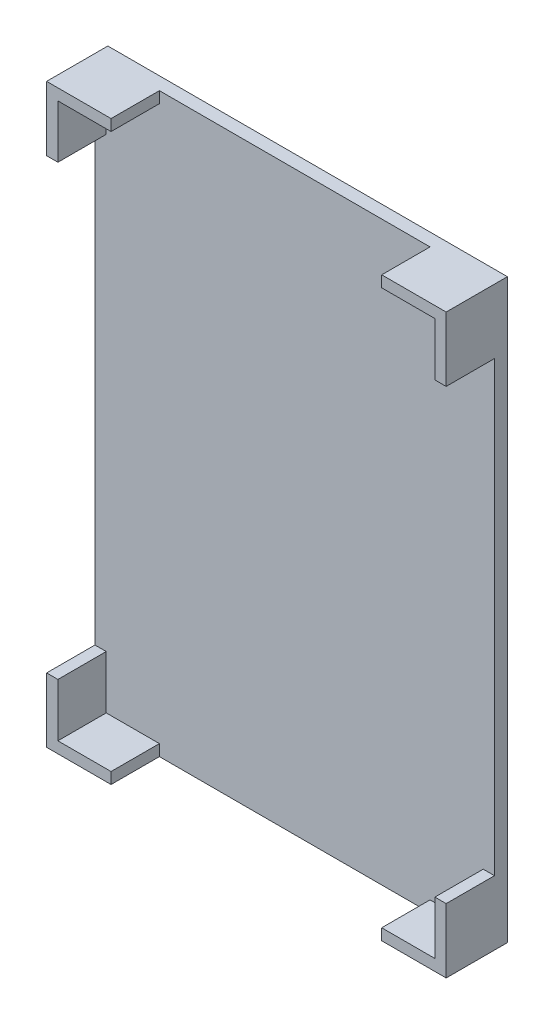
ISO-10303-21;
HEADER;
FILE_DESCRIPTION(('STEP AP214'),'2;1');
FILE_NAME('part.step','',(''),(''),'','','');
FILE_SCHEMA(('AUTOMOTIVE_DESIGN { 1 0 10303 214 1 1 1 1 }'));
ENDSEC;
DATA;
#1=APPLICATION_CONTEXT('core data for automotive mechanical design processes');
#2=APPLICATION_PROTOCOL_DEFINITION('international standard','automotive_design',2000,#1);
#3=PRODUCT_CONTEXT('',#1,'mechanical');
#4=PRODUCT('Part','Part','',(#3));
#5=PRODUCT_RELATED_PRODUCT_CATEGORY('part','',(#4));
#6=PRODUCT_DEFINITION_FORMATION('','',#4);
#7=PRODUCT_DEFINITION_CONTEXT('part definition',#1,'design');
#8=PRODUCT_DEFINITION('design','',#6,#7);
#9=PRODUCT_DEFINITION_SHAPE('','',#8);
#10=(LENGTH_UNIT() NAMED_UNIT(*) SI_UNIT(.MILLI.,.METRE.));
#11=(NAMED_UNIT(*) PLANE_ANGLE_UNIT() SI_UNIT($,.RADIAN.));
#12=(NAMED_UNIT(*) SI_UNIT($,.STERADIAN.) SOLID_ANGLE_UNIT());
#13=UNCERTAINTY_MEASURE_WITH_UNIT(LENGTH_MEASURE(1.E-05),#10,'distance_accuracy_value','');
#14=(GEOMETRIC_REPRESENTATION_CONTEXT(3) GLOBAL_UNCERTAINTY_ASSIGNED_CONTEXT((#13)) GLOBAL_UNIT_ASSIGNED_CONTEXT((#10,
#11,#12)) REPRESENTATION_CONTEXT('',''));
#15=CARTESIAN_POINT('',(0.,0.,0.));
#16=DIRECTION('',(0.,0.,1.));
#17=DIRECTION('',(1.,0.,0.));
#18=AXIS2_PLACEMENT_3D('',#15,#16,#17);
#19=CARTESIAN_POINT('',(0.,0.,4.));
#20=DIRECTION('',(0.,0.,1.));
#21=DIRECTION('',(1.,0.,0.));
#22=AXIS2_PLACEMENT_3D('',#19,#20,#21);
#23=PLANE('',#22);
#24=DIRECTION('',(0.,-1.,0.));
#25=VECTOR('',#24,1.);
#26=CARTESIAN_POINT('',(-62.,89.5,4.));
#27=LINE('',#26,#25);
#28=CARTESIAN_POINT('',(-62.,69.5,4.));
#29=VERTEX_POINT('',#28);
#30=CARTESIAN_POINT('',(-62.,-69.4999999999999,4.));
#31=VERTEX_POINT('',#30);
#32=EDGE_CURVE('E351',#29,#31,#27,.T.);
#33=ORIENTED_EDGE('',*,*,#32,.T.);
#34=DIRECTION('',(-1.,0.,0.));
#35=VECTOR('',#34,1.);
#36=CARTESIAN_POINT('',(-62.,-69.5,4.));
#37=LINE('',#36,#35);
#38=CARTESIAN_POINT('',(-58.5,-69.5,4.));
#39=VERTEX_POINT('',#38);
#40=EDGE_CURVE('E56',#39,#31,#37,.T.);
#41=ORIENTED_EDGE('',*,*,#40,.F.);
#42=DIRECTION('',(0.,1.,0.));
#43=VECTOR('',#42,1.);
#44=CARTESIAN_POINT('',(-58.5,-69.5,4.));
#45=LINE('',#44,#43);
#46=CARTESIAN_POINT('',(-58.5,-86.,4.));
#47=VERTEX_POINT('',#46);
#48=EDGE_CURVE('E60',#47,#39,#45,.T.);
#49=ORIENTED_EDGE('',*,*,#48,.F.);
#50=DIRECTION('',(-1.,0.,0.));
#51=VECTOR('',#50,1.);
#52=CARTESIAN_POINT('',(-58.5,-86.,4.));
#53=LINE('',#52,#51);
#54=CARTESIAN_POINT('',(-42.,-86.,4.));
#55=VERTEX_POINT('',#54);
#56=EDGE_CURVE('E222',#55,#47,#53,.T.);
#57=ORIENTED_EDGE('',*,*,#56,.F.);
#58=DIRECTION('',(0.,1.,0.));
#59=VECTOR('',#58,1.);
#60=CARTESIAN_POINT('',(-42.,-86.,4.));
#61=LINE('',#60,#59);
#62=CARTESIAN_POINT('',(-42.,-89.5,4.));
#63=VERTEX_POINT('',#62);
#64=EDGE_CURVE('E219',#63,#55,#61,.T.);
#65=ORIENTED_EDGE('',*,*,#64,.F.);
#66=DIRECTION('',(1.,0.,0.));
#67=VECTOR('',#66,1.);
#68=CARTESIAN_POINT('',(-62.,-89.5,4.));
#69=LINE('',#68,#67);
#70=CARTESIAN_POINT('',(42.,-89.5,4.));
#71=VERTEX_POINT('',#70);
#72=EDGE_CURVE('E353',#63,#71,#69,.T.);
#73=ORIENTED_EDGE('',*,*,#72,.T.);
#74=DIRECTION('',(0.,-1.,0.));
#75=VECTOR('',#74,1.);
#76=CARTESIAN_POINT('',(42.,-86.,4.));
#77=LINE('',#76,#75);
#78=CARTESIAN_POINT('',(42.,-86.,4.));
#79=VERTEX_POINT('',#78);
#80=EDGE_CURVE('E236',#79,#71,#77,.T.);
#81=ORIENTED_EDGE('',*,*,#80,.F.);
#82=DIRECTION('',(-1.,0.,0.));
#83=VECTOR('',#82,1.);
#84=CARTESIAN_POINT('',(58.5,-86.,4.));
#85=LINE('',#84,#83);
#86=CARTESIAN_POINT('',(58.5,-86.,4.));
#87=VERTEX_POINT('',#86);
#88=EDGE_CURVE('E249',#87,#79,#85,.T.);
#89=ORIENTED_EDGE('',*,*,#88,.F.);
#90=DIRECTION('',(0.,-1.,0.));
#91=VECTOR('',#90,1.);
#92=CARTESIAN_POINT('',(58.5,-69.5,4.));
#93=LINE('',#92,#91);
#94=CARTESIAN_POINT('',(58.5,-69.5,4.));
#95=VERTEX_POINT('',#94);
#96=EDGE_CURVE('E226',#95,#87,#93,.T.);
#97=ORIENTED_EDGE('',*,*,#96,.F.);
#98=DIRECTION('',(-1.,0.,0.));
#99=VECTOR('',#98,1.);
#100=CARTESIAN_POINT('',(62.,-69.5,4.));
#101=LINE('',#100,#99);
#102=CARTESIAN_POINT('',(62.,-69.4999999999999,4.));
#103=VERTEX_POINT('',#102);
#104=EDGE_CURVE('E223',#103,#95,#101,.T.);
#105=ORIENTED_EDGE('',*,*,#104,.F.);
#106=DIRECTION('',(0.,1.,0.));
#107=VECTOR('',#106,1.);
#108=CARTESIAN_POINT('',(62.,89.5,4.));
#109=LINE('',#108,#107);
#110=CARTESIAN_POINT('',(62.,69.5,4.));
#111=VERTEX_POINT('',#110);
#112=EDGE_CURVE('E346',#103,#111,#109,.T.);
#113=ORIENTED_EDGE('',*,*,#112,.T.);
#114=DIRECTION('',(1.,0.,0.));
#115=VECTOR('',#114,1.);
#116=CARTESIAN_POINT('',(62.,69.5,4.));
#117=LINE('',#116,#115);
#118=CARTESIAN_POINT('',(58.5,69.5,4.));
#119=VERTEX_POINT('',#118);
#120=EDGE_CURVE('E289',#119,#111,#117,.T.);
#121=ORIENTED_EDGE('',*,*,#120,.F.);
#122=DIRECTION('',(0.,-1.,0.));
#123=VECTOR('',#122,1.);
#124=CARTESIAN_POINT('',(58.5,69.5,4.));
#125=LINE('',#124,#123);
#126=CARTESIAN_POINT('',(58.5,86.,4.));
#127=VERTEX_POINT('',#126);
#128=EDGE_CURVE('E287',#127,#119,#125,.T.);
#129=ORIENTED_EDGE('',*,*,#128,.F.);
#130=DIRECTION('',(1.,0.,0.));
#131=VECTOR('',#130,1.);
#132=CARTESIAN_POINT('',(58.5,86.,4.));
#133=LINE('',#132,#131);
#134=CARTESIAN_POINT('',(42.,86.,4.));
#135=VERTEX_POINT('',#134);
#136=EDGE_CURVE('E268',#135,#127,#133,.T.);
#137=ORIENTED_EDGE('',*,*,#136,.F.);
#138=DIRECTION('',(0.,-1.,0.));
#139=VECTOR('',#138,1.);
#140=CARTESIAN_POINT('',(42.,86.,4.));
#141=LINE('',#140,#139);
#142=CARTESIAN_POINT('',(42.,89.5,4.));
#143=VERTEX_POINT('',#142);
#144=EDGE_CURVE('E273',#143,#135,#141,.T.);
#145=ORIENTED_EDGE('',*,*,#144,.F.);
#146=DIRECTION('',(-1.,0.,0.));
#147=VECTOR('',#146,1.);
#148=CARTESIAN_POINT('',(-62.,89.5,4.));
#149=LINE('',#148,#147);
#150=CARTESIAN_POINT('',(-42.,89.5,4.));
#151=VERTEX_POINT('',#150);
#152=EDGE_CURVE('E348',#143,#151,#149,.T.);
#153=ORIENTED_EDGE('',*,*,#152,.T.);
#154=DIRECTION('',(0.,1.,0.));
#155=VECTOR('',#154,1.);
#156=CARTESIAN_POINT('',(-42.,86.,4.));
#157=LINE('',#156,#155);
#158=CARTESIAN_POINT('',(-42.,86.,4.));
#159=VERTEX_POINT('',#158);
#160=EDGE_CURVE('E310',#159,#151,#157,.T.);
#161=ORIENTED_EDGE('',*,*,#160,.F.);
#162=DIRECTION('',(1.,0.,0.));
#163=VECTOR('',#162,1.);
#164=CARTESIAN_POINT('',(-58.5,86.,4.));
#165=LINE('',#164,#163);
#166=CARTESIAN_POINT('',(-58.5,86.,4.));
#167=VERTEX_POINT('',#166);
#168=EDGE_CURVE('E326',#167,#159,#165,.T.);
#169=ORIENTED_EDGE('',*,*,#168,.F.);
#170=DIRECTION('',(0.,1.,0.));
#171=VECTOR('',#170,1.);
#172=CARTESIAN_POINT('',(-58.5,69.5,4.));
#173=LINE('',#172,#171);
#174=CARTESIAN_POINT('',(-58.5,69.5,4.));
#175=VERTEX_POINT('',#174);
#176=EDGE_CURVE('E323',#175,#167,#173,.T.);
#177=ORIENTED_EDGE('',*,*,#176,.F.);
#178=DIRECTION('',(1.,0.,0.));
#179=VECTOR('',#178,1.);
#180=CARTESIAN_POINT('',(-62.,69.5,4.));
#181=LINE('',#180,#179);
#182=EDGE_CURVE('E305',#29,#175,#181,.T.);
#183=ORIENTED_EDGE('',*,*,#182,.F.);
#184=EDGE_LOOP('',(#33,#41,#49,#57,#65,#73,#81,#89,#97,#105,#113,#121,#129,#137,#145,#153,#161,
#169,#177,#183));
#185=FACE_BOUND('',#184,.T.);
#186=ADVANCED_FACE('F41',(#185),#23,.T.);
#187=CARTESIAN_POINT('',(62.,89.5,4.));
#188=DIRECTION('',(-1.,0.,0.));
#189=DIRECTION('',(0.,-1.,0.));
#190=AXIS2_PLACEMENT_3D('',#187,#188,#189);
#191=PLANE('',#190);
#192=DIRECTION('',(0.,1.,0.));
#193=VECTOR('',#192,1.);
#194=CARTESIAN_POINT('',(62.,89.5,0.));
#195=LINE('',#194,#193);
#196=CARTESIAN_POINT('',(62.,-89.5,0.));
#197=VERTEX_POINT('',#196);
#198=CARTESIAN_POINT('',(62.,89.5,0.));
#199=VERTEX_POINT('',#198);
#200=EDGE_CURVE('E345',#197,#199,#195,.T.);
#201=ORIENTED_EDGE('',*,*,#200,.T.);
#202=DIRECTION('',(0.,0.,-1.));
#203=VECTOR('',#202,1.);
#204=CARTESIAN_POINT('',(62.,89.5,4.));
#205=LINE('',#204,#203);
#206=CARTESIAN_POINT('',(62.,89.5,19.));
#207=VERTEX_POINT('',#206);
#208=EDGE_CURVE('E11',#207,#199,#205,.T.);
#209=ORIENTED_EDGE('',*,*,#208,.F.);
#210=DIRECTION('',(0.,1.,0.));
#211=VECTOR('',#210,1.);
#212=CARTESIAN_POINT('',(62.,89.5,19.));
#213=LINE('',#212,#211);
#214=CARTESIAN_POINT('',(62.,69.5,19.));
#215=VERTEX_POINT('',#214);
#216=EDGE_CURVE('E277',#215,#207,#213,.T.);
#217=ORIENTED_EDGE('',*,*,#216,.F.);
#218=DIRECTION('',(0.,0.,-1.));
#219=VECTOR('',#218,1.);
#220=CARTESIAN_POINT('',(62.,69.5,19.));
#221=LINE('',#220,#219);
#222=EDGE_CURVE('E297',#215,#111,#221,.T.);
#223=ORIENTED_EDGE('',*,*,#222,.T.);
#224=ORIENTED_EDGE('',*,*,#112,.F.);
#225=DIRECTION('',(0.,0.,-1.));
#226=VECTOR('',#225,1.);
#227=CARTESIAN_POINT('',(62.,-69.5,19.));
#228=LINE('',#227,#226);
#229=CARTESIAN_POINT('',(62.,-69.5,19.));
#230=VERTEX_POINT('',#229);
#231=EDGE_CURVE('E265',#230,#103,#228,.T.);
#232=ORIENTED_EDGE('',*,*,#231,.F.);
#233=DIRECTION('',(0.,1.,0.));
#234=VECTOR('',#233,1.);
#235=CARTESIAN_POINT('',(62.,-89.5,19.));
#236=LINE('',#235,#234);
#237=CARTESIAN_POINT('',(62.,-89.5,19.));
#238=VERTEX_POINT('',#237);
#239=EDGE_CURVE('E235',#238,#230,#236,.T.);
#240=ORIENTED_EDGE('',*,*,#239,.F.);
#241=DIRECTION('',(0.,0.,-1.));
#242=VECTOR('',#241,1.);
#243=CARTESIAN_POINT('',(62.,-89.5,4.));
#244=LINE('',#243,#242);
#245=EDGE_CURVE('E355',#238,#197,#244,.T.);
#246=ORIENTED_EDGE('',*,*,#245,.T.);
#247=EDGE_LOOP('',(#201,#209,#217,#223,#224,#232,#240,#246));
#248=FACE_BOUND('',#247,.T.);
#249=ADVANCED_FACE('F43',(#248),#191,.F.);
#250=CARTESIAN_POINT('',(-62.,89.5,4.));
#251=DIRECTION('',(0.,-1.,0.));
#252=DIRECTION('',(1.,0.,0.));
#253=AXIS2_PLACEMENT_3D('',#250,#251,#252);
#254=PLANE('',#253);
#255=DIRECTION('',(-1.,0.,0.));
#256=VECTOR('',#255,1.);
#257=CARTESIAN_POINT('',(-62.,89.5,0.));
#258=LINE('',#257,#256);
#259=CARTESIAN_POINT('',(-62.,89.5,0.));
#260=VERTEX_POINT('',#259);
#261=EDGE_CURVE('E358',#199,#260,#258,.T.);
#262=ORIENTED_EDGE('',*,*,#261,.T.);
#263=DIRECTION('',(0.,0.,-1.));
#264=VECTOR('',#263,1.);
#265=CARTESIAN_POINT('',(-62.,89.5,4.));
#266=LINE('',#265,#264);
#267=CARTESIAN_POINT('',(-62.,89.5,19.));
#268=VERTEX_POINT('',#267);
#269=EDGE_CURVE('E49',#268,#260,#266,.T.);
#270=ORIENTED_EDGE('',*,*,#269,.F.);
#271=DIRECTION('',(-1.,0.,0.));
#272=VECTOR('',#271,1.);
#273=CARTESIAN_POINT('',(-42.,89.5,19.));
#274=LINE('',#273,#272);
#275=CARTESIAN_POINT('',(-42.,89.5,19.));
#276=VERTEX_POINT('',#275);
#277=EDGE_CURVE('E306',#276,#268,#274,.T.);
#278=ORIENTED_EDGE('',*,*,#277,.F.);
#279=DIRECTION('',(0.,0.,-1.));
#280=VECTOR('',#279,1.);
#281=CARTESIAN_POINT('',(-42.,89.5,19.));
#282=LINE('',#281,#280);
#283=EDGE_CURVE('E320',#276,#151,#282,.T.);
#284=ORIENTED_EDGE('',*,*,#283,.T.);
#285=ORIENTED_EDGE('',*,*,#152,.F.);
#286=DIRECTION('',(0.,0.,-1.));
#287=VECTOR('',#286,1.);
#288=CARTESIAN_POINT('',(42.,89.5,19.));
#289=LINE('',#288,#287);
#290=CARTESIAN_POINT('',(42.,89.5,19.));
#291=VERTEX_POINT('',#290);
#292=EDGE_CURVE('E295',#291,#143,#289,.T.);
#293=ORIENTED_EDGE('',*,*,#292,.F.);
#294=DIRECTION('',(-1.,0.,0.));
#295=VECTOR('',#294,1.);
#296=CARTESIAN_POINT('',(42.,89.5,19.));
#297=LINE('',#296,#295);
#298=EDGE_CURVE('E280',#207,#291,#297,.T.);
#299=ORIENTED_EDGE('',*,*,#298,.F.);
#300=ORIENTED_EDGE('',*,*,#208,.T.);
#301=EDGE_LOOP('',(#262,#270,#278,#284,#285,#293,#299,#300));
#302=FACE_BOUND('',#301,.T.);
#303=ADVANCED_FACE('F423',(#302),#254,.F.);
#304=CARTESIAN_POINT('',(-62.,89.5,4.));
#305=DIRECTION('',(1.,0.,0.));
#306=DIRECTION('',(0.,1.,0.));
#307=AXIS2_PLACEMENT_3D('',#304,#305,#306);
#308=PLANE('',#307);
#309=DIRECTION('',(0.,-1.,0.));
#310=VECTOR('',#309,1.);
#311=CARTESIAN_POINT('',(-62.,89.5,0.));
#312=LINE('',#311,#310);
#313=CARTESIAN_POINT('',(-62.,-89.5,0.));
#314=VERTEX_POINT('',#313);
#315=EDGE_CURVE('E360',#260,#314,#312,.T.);
#316=ORIENTED_EDGE('',*,*,#315,.T.);
#317=DIRECTION('',(0.,0.,-1.));
#318=VECTOR('',#317,1.);
#319=CARTESIAN_POINT('',(-62.,-89.5,4.));
#320=LINE('',#319,#318);
#321=CARTESIAN_POINT('',(-62.,-89.5,19.));
#322=VERTEX_POINT('',#321);
#323=EDGE_CURVE('E365',#322,#314,#320,.T.);
#324=ORIENTED_EDGE('',*,*,#323,.F.);
#325=DIRECTION('',(0.,-1.,0.));
#326=VECTOR('',#325,1.);
#327=CARTESIAN_POINT('',(-62.,-89.5,19.));
#328=LINE('',#327,#326);
#329=CARTESIAN_POINT('',(-62.,-69.5,19.));
#330=VERTEX_POINT('',#329);
#331=EDGE_CURVE('E493',#330,#322,#328,.T.);
#332=ORIENTED_EDGE('',*,*,#331,.F.);
#333=DIRECTION('',(0.,0.,-1.));
#334=VECTOR('',#333,1.);
#335=CARTESIAN_POINT('',(-62.,-69.5,19.));
#336=LINE('',#335,#334);
#337=EDGE_CURVE('E228',#330,#31,#336,.T.);
#338=ORIENTED_EDGE('',*,*,#337,.T.);
#339=ORIENTED_EDGE('',*,*,#32,.F.);
#340=DIRECTION('',(0.,0.,-1.));
#341=VECTOR('',#340,1.);
#342=CARTESIAN_POINT('',(-62.,69.5,19.));
#343=LINE('',#342,#341);
#344=CARTESIAN_POINT('',(-62.,69.5,19.));
#345=VERTEX_POINT('',#344);
#346=EDGE_CURVE('E342',#345,#29,#343,.T.);
#347=ORIENTED_EDGE('',*,*,#346,.F.);
#348=DIRECTION('',(0.,-1.,0.));
#349=VECTOR('',#348,1.);
#350=CARTESIAN_POINT('',(-62.,89.5,19.));
#351=LINE('',#350,#349);
#352=EDGE_CURVE('E309',#268,#345,#351,.T.);
#353=ORIENTED_EDGE('',*,*,#352,.F.);
#354=ORIENTED_EDGE('',*,*,#269,.T.);
#355=EDGE_LOOP('',(#316,#324,#332,#338,#339,#347,#353,#354));
#356=FACE_BOUND('',#355,.T.);
#357=ADVANCED_FACE('F371',(#356),#308,.F.);
#358=CARTESIAN_POINT('',(-62.,-89.5,4.));
#359=DIRECTION('',(0.,1.,0.));
#360=DIRECTION('',(0.,0.,1.));
#361=AXIS2_PLACEMENT_3D('',#358,#359,#360);
#362=PLANE('',#361);
#363=DIRECTION('',(1.,0.,0.));
#364=VECTOR('',#363,1.);
#365=CARTESIAN_POINT('',(-62.,-89.5,0.));
#366=LINE('',#365,#364);
#367=EDGE_CURVE('E349',#314,#197,#366,.T.);
#368=ORIENTED_EDGE('',*,*,#367,.T.);
#369=ORIENTED_EDGE('',*,*,#245,.F.);
#370=DIRECTION('',(1.,0.,0.));
#371=VECTOR('',#370,1.);
#372=CARTESIAN_POINT('',(42.,-89.5,19.));
#373=LINE('',#372,#371);
#374=CARTESIAN_POINT('',(42.,-89.5,19.));
#375=VERTEX_POINT('',#374);
#376=EDGE_CURVE('E232',#375,#238,#373,.T.);
#377=ORIENTED_EDGE('',*,*,#376,.F.);
#378=DIRECTION('',(0.,0.,-1.));
#379=VECTOR('',#378,1.);
#380=CARTESIAN_POINT('',(42.,-89.5,19.));
#381=LINE('',#380,#379);
#382=EDGE_CURVE('E245',#375,#71,#381,.T.);
#383=ORIENTED_EDGE('',*,*,#382,.T.);
#384=ORIENTED_EDGE('',*,*,#72,.F.);
#385=DIRECTION('',(0.,0.,-1.));
#386=VECTOR('',#385,1.);
#387=CARTESIAN_POINT('',(-42.,-89.5,19.));
#388=LINE('',#387,#386);
#389=CARTESIAN_POINT('',(-42.,-89.5,19.));
#390=VERTEX_POINT('',#389);
#391=EDGE_CURVE('E487',#390,#63,#388,.T.);
#392=ORIENTED_EDGE('',*,*,#391,.F.);
#393=DIRECTION('',(1.,0.,0.));
#394=VECTOR('',#393,1.);
#395=CARTESIAN_POINT('',(-42.,-89.5,19.));
#396=LINE('',#395,#394);
#397=EDGE_CURVE('E491',#322,#390,#396,.T.);
#398=ORIENTED_EDGE('',*,*,#397,.F.);
#399=ORIENTED_EDGE('',*,*,#323,.T.);
#400=EDGE_LOOP('',(#368,#369,#377,#383,#384,#392,#398,#399));
#401=FACE_BOUND('',#400,.T.);
#402=ADVANCED_FACE('F380',(#401),#362,.F.);
#403=CARTESIAN_POINT('',(0.,0.,0.));
#404=DIRECTION('',(0.,0.,1.));
#405=DIRECTION('',(1.,0.,0.));
#406=AXIS2_PLACEMENT_3D('',#403,#404,#405);
#407=PLANE('',#406);
#408=ORIENTED_EDGE('',*,*,#200,.F.);
#409=ORIENTED_EDGE('',*,*,#367,.F.);
#410=ORIENTED_EDGE('',*,*,#315,.F.);
#411=ORIENTED_EDGE('',*,*,#261,.F.);
#412=EDGE_LOOP('',(#408,#409,#410,#411));
#413=FACE_BOUND('',#412,.T.);
#414=ADVANCED_FACE('F378',(#413),#407,.F.);
#415=CARTESIAN_POINT('',(-62.,69.5,19.));
#416=DIRECTION('',(0.,1.,0.));
#417=DIRECTION('',(0.,0.,1.));
#418=AXIS2_PLACEMENT_3D('',#415,#416,#417);
#419=PLANE('',#418);
#420=ORIENTED_EDGE('',*,*,#182,.T.);
#421=DIRECTION('',(0.,0.,-1.));
#422=VECTOR('',#421,1.);
#423=CARTESIAN_POINT('',(-58.5,69.5,19.));
#424=LINE('',#423,#422);
#425=CARTESIAN_POINT('',(-58.5,69.5,19.));
#426=VERTEX_POINT('',#425);
#427=EDGE_CURVE('E339',#426,#175,#424,.T.);
#428=ORIENTED_EDGE('',*,*,#427,.F.);
#429=DIRECTION('',(1.,0.,0.));
#430=VECTOR('',#429,1.);
#431=CARTESIAN_POINT('',(-62.,69.5,19.));
#432=LINE('',#431,#430);
#433=EDGE_CURVE('E312',#345,#426,#432,.T.);
#434=ORIENTED_EDGE('',*,*,#433,.F.);
#435=ORIENTED_EDGE('',*,*,#346,.T.);
#436=EDGE_LOOP('',(#420,#428,#434,#435));
#437=FACE_BOUND('',#436,.T.);
#438=ADVANCED_FACE('F426',(#437),#419,.F.);
#439=CARTESIAN_POINT('',(-58.5,69.5,19.));
#440=DIRECTION('',(-1.,0.,0.));
#441=DIRECTION('',(0.,0.,1.));
#442=AXIS2_PLACEMENT_3D('',#439,#440,#441);
#443=PLANE('',#442);
#444=ORIENTED_EDGE('',*,*,#176,.T.);
#445=DIRECTION('',(0.,0.,-1.));
#446=VECTOR('',#445,1.);
#447=CARTESIAN_POINT('',(-58.5,86.,19.));
#448=LINE('',#447,#446);
#449=CARTESIAN_POINT('',(-58.5,86.,19.));
#450=VERTEX_POINT('',#449);
#451=EDGE_CURVE('E336',#450,#167,#448,.T.);
#452=ORIENTED_EDGE('',*,*,#451,.F.);
#453=DIRECTION('',(0.,1.,0.));
#454=VECTOR('',#453,1.);
#455=CARTESIAN_POINT('',(-58.5,69.5,19.));
#456=LINE('',#455,#454);
#457=EDGE_CURVE('E314',#426,#450,#456,.T.);
#458=ORIENTED_EDGE('',*,*,#457,.F.);
#459=ORIENTED_EDGE('',*,*,#427,.T.);
#460=EDGE_LOOP('',(#444,#452,#458,#459));
#461=FACE_BOUND('',#460,.T.);
#462=ADVANCED_FACE('F469',(#461),#443,.F.);
#463=CARTESIAN_POINT('',(-58.5,86.,19.));
#464=DIRECTION('',(0.,1.,0.));
#465=DIRECTION('',(0.,0.,1.));
#466=AXIS2_PLACEMENT_3D('',#463,#464,#465);
#467=PLANE('',#466);
#468=ORIENTED_EDGE('',*,*,#168,.T.);
#469=DIRECTION('',(0.,0.,-1.));
#470=VECTOR('',#469,1.);
#471=CARTESIAN_POINT('',(-42.,86.,19.));
#472=LINE('',#471,#470);
#473=CARTESIAN_POINT('',(-42.,86.,19.));
#474=VERTEX_POINT('',#473);
#475=EDGE_CURVE('E333',#474,#159,#472,.T.);
#476=ORIENTED_EDGE('',*,*,#475,.F.);
#477=DIRECTION('',(1.,0.,0.));
#478=VECTOR('',#477,1.);
#479=CARTESIAN_POINT('',(-58.5,86.,19.));
#480=LINE('',#479,#478);
#481=EDGE_CURVE('E316',#450,#474,#480,.T.);
#482=ORIENTED_EDGE('',*,*,#481,.F.);
#483=ORIENTED_EDGE('',*,*,#451,.T.);
#484=EDGE_LOOP('',(#468,#476,#482,#483));
#485=FACE_BOUND('',#484,.T.);
#486=ADVANCED_FACE('F464',(#485),#467,.F.);
#487=CARTESIAN_POINT('',(-42.,86.,19.));
#488=DIRECTION('',(-1.,0.,0.));
#489=DIRECTION('',(0.,0.,1.));
#490=AXIS2_PLACEMENT_3D('',#487,#488,#489);
#491=PLANE('',#490);
#492=ORIENTED_EDGE('',*,*,#160,.T.);
#493=ORIENTED_EDGE('',*,*,#283,.F.);
#494=DIRECTION('',(0.,1.,0.));
#495=VECTOR('',#494,1.);
#496=CARTESIAN_POINT('',(-42.,86.,19.));
#497=LINE('',#496,#495);
#498=EDGE_CURVE('E318',#474,#276,#497,.T.);
#499=ORIENTED_EDGE('',*,*,#498,.F.);
#500=ORIENTED_EDGE('',*,*,#475,.T.);
#501=EDGE_LOOP('',(#492,#493,#499,#500));
#502=FACE_BOUND('',#501,.T.);
#503=ADVANCED_FACE('F461',(#502),#491,.F.);
#504=CARTESIAN_POINT('',(0.,0.,19.));
#505=DIRECTION('',(0.,0.,1.));
#506=DIRECTION('',(1.,0.,0.));
#507=AXIS2_PLACEMENT_3D('',#504,#505,#506);
#508=PLANE('',#507);
#509=ORIENTED_EDGE('',*,*,#277,.T.);
#510=ORIENTED_EDGE('',*,*,#352,.T.);
#511=ORIENTED_EDGE('',*,*,#433,.T.);
#512=ORIENTED_EDGE('',*,*,#457,.T.);
#513=ORIENTED_EDGE('',*,*,#481,.T.);
#514=ORIENTED_EDGE('',*,*,#498,.T.);
#515=EDGE_LOOP('',(#509,#510,#511,#512,#513,#514));
#516=FACE_BOUND('',#515,.T.);
#517=ADVANCED_FACE('F604',(#516),#508,.T.);
#518=CARTESIAN_POINT('',(58.5,86.,19.));
#519=DIRECTION('',(0.,1.,0.));
#520=DIRECTION('',(0.,0.,1.));
#521=AXIS2_PLACEMENT_3D('',#518,#519,#520);
#522=PLANE('',#521);
#523=ORIENTED_EDGE('',*,*,#136,.T.);
#524=DIRECTION('',(0.,0.,-1.));
#525=VECTOR('',#524,1.);
#526=CARTESIAN_POINT('',(58.5,86.,19.));
#527=LINE('',#526,#525);
#528=CARTESIAN_POINT('',(58.5,86.,19.));
#529=VERTEX_POINT('',#528);
#530=EDGE_CURVE('E303',#529,#127,#527,.T.);
#531=ORIENTED_EDGE('',*,*,#530,.F.);
#532=DIRECTION('',(1.,0.,0.));
#533=VECTOR('',#532,1.);
#534=CARTESIAN_POINT('',(58.5,86.,19.));
#535=LINE('',#534,#533);
#536=CARTESIAN_POINT('',(42.,86.,19.));
#537=VERTEX_POINT('',#536);
#538=EDGE_CURVE('E269',#537,#529,#535,.T.);
#539=ORIENTED_EDGE('',*,*,#538,.F.);
#540=DIRECTION('',(0.,0.,-1.));
#541=VECTOR('',#540,1.);
#542=CARTESIAN_POINT('',(42.,86.,19.));
#543=LINE('',#542,#541);
#544=EDGE_CURVE('E284',#537,#135,#543,.T.);
#545=ORIENTED_EDGE('',*,*,#544,.T.);
#546=EDGE_LOOP('',(#523,#531,#539,#545));
#547=FACE_BOUND('',#546,.T.);
#548=ADVANCED_FACE('F453',(#547),#522,.F.);
#549=CARTESIAN_POINT('',(58.5,69.5,19.));
#550=DIRECTION('',(1.,0.,0.));
#551=DIRECTION('',(0.,0.,-1.));
#552=AXIS2_PLACEMENT_3D('',#549,#550,#551);
#553=PLANE('',#552);
#554=ORIENTED_EDGE('',*,*,#128,.T.);
#555=DIRECTION('',(0.,0.,-1.));
#556=VECTOR('',#555,1.);
#557=CARTESIAN_POINT('',(58.5,69.5,19.));
#558=LINE('',#557,#556);
#559=CARTESIAN_POINT('',(58.5,69.5,19.));
#560=VERTEX_POINT('',#559);
#561=EDGE_CURVE('E300',#560,#119,#558,.T.);
#562=ORIENTED_EDGE('',*,*,#561,.F.);
#563=DIRECTION('',(0.,-1.,0.));
#564=VECTOR('',#563,1.);
#565=CARTESIAN_POINT('',(58.5,69.5,19.));
#566=LINE('',#565,#564);
#567=EDGE_CURVE('E272',#529,#560,#566,.T.);
#568=ORIENTED_EDGE('',*,*,#567,.F.);
#569=ORIENTED_EDGE('',*,*,#530,.T.);
#570=EDGE_LOOP('',(#554,#562,#568,#569));
#571=FACE_BOUND('',#570,.T.);
#572=ADVANCED_FACE('F449',(#571),#553,.F.);
#573=CARTESIAN_POINT('',(62.,69.5,19.));
#574=DIRECTION('',(0.,1.,0.));
#575=DIRECTION('',(0.,0.,1.));
#576=AXIS2_PLACEMENT_3D('',#573,#574,#575);
#577=PLANE('',#576);
#578=ORIENTED_EDGE('',*,*,#120,.T.);
#579=ORIENTED_EDGE('',*,*,#222,.F.);
#580=DIRECTION('',(1.,0.,0.));
#581=VECTOR('',#580,1.);
#582=CARTESIAN_POINT('',(62.,69.5,19.));
#583=LINE('',#582,#581);
#584=EDGE_CURVE('E275',#560,#215,#583,.T.);
#585=ORIENTED_EDGE('',*,*,#584,.F.);
#586=ORIENTED_EDGE('',*,*,#561,.T.);
#587=EDGE_LOOP('',(#578,#579,#585,#586));
#588=FACE_BOUND('',#587,.T.);
#589=ADVANCED_FACE('F443',(#588),#577,.F.);
#590=CARTESIAN_POINT('',(42.,86.,19.));
#591=DIRECTION('',(1.,0.,0.));
#592=DIRECTION('',(0.,0.,-1.));
#593=AXIS2_PLACEMENT_3D('',#590,#591,#592);
#594=PLANE('',#593);
#595=ORIENTED_EDGE('',*,*,#144,.T.);
#596=ORIENTED_EDGE('',*,*,#544,.F.);
#597=DIRECTION('',(0.,-1.,0.));
#598=VECTOR('',#597,1.);
#599=CARTESIAN_POINT('',(42.,86.,19.));
#600=LINE('',#599,#598);
#601=EDGE_CURVE('E282',#291,#537,#600,.T.);
#602=ORIENTED_EDGE('',*,*,#601,.F.);
#603=ORIENTED_EDGE('',*,*,#292,.T.);
#604=EDGE_LOOP('',(#595,#596,#602,#603));
#605=FACE_BOUND('',#604,.T.);
#606=ADVANCED_FACE('F415',(#605),#594,.F.);
#607=CARTESIAN_POINT('',(0.,0.,19.));
#608=DIRECTION('',(0.,0.,-1.));
#609=DIRECTION('',(-1.,0.,0.));
#610=AXIS2_PLACEMENT_3D('',#607,#608,#609);
#611=PLANE('',#610);
#612=ORIENTED_EDGE('',*,*,#538,.T.);
#613=ORIENTED_EDGE('',*,*,#567,.T.);
#614=ORIENTED_EDGE('',*,*,#584,.T.);
#615=ORIENTED_EDGE('',*,*,#216,.T.);
#616=ORIENTED_EDGE('',*,*,#298,.T.);
#617=ORIENTED_EDGE('',*,*,#601,.T.);
#618=EDGE_LOOP('',(#612,#613,#614,#615,#616,#617));
#619=FACE_BOUND('',#618,.T.);
#620=ADVANCED_FACE('F408',(#619),#611,.F.);
#621=CARTESIAN_POINT('',(62.,-69.5,19.));
#622=DIRECTION('',(0.,-1.,0.));
#623=DIRECTION('',(0.,0.,-1.));
#624=AXIS2_PLACEMENT_3D('',#621,#622,#623);
#625=PLANE('',#624);
#626=ORIENTED_EDGE('',*,*,#104,.T.);
#627=DIRECTION('',(0.,0.,-1.));
#628=VECTOR('',#627,1.);
#629=CARTESIAN_POINT('',(58.5,-69.5,19.));
#630=LINE('',#629,#628);
#631=CARTESIAN_POINT('',(58.5,-69.5,19.));
#632=VERTEX_POINT('',#631);
#633=EDGE_CURVE('E262',#632,#95,#630,.T.);
#634=ORIENTED_EDGE('',*,*,#633,.F.);
#635=DIRECTION('',(-1.,0.,0.));
#636=VECTOR('',#635,1.);
#637=CARTESIAN_POINT('',(62.,-69.5,19.));
#638=LINE('',#637,#636);
#639=EDGE_CURVE('E238',#230,#632,#638,.T.);
#640=ORIENTED_EDGE('',*,*,#639,.F.);
#641=ORIENTED_EDGE('',*,*,#231,.T.);
#642=EDGE_LOOP('',(#626,#634,#640,#641));
#643=FACE_BOUND('',#642,.T.);
#644=ADVANCED_FACE('F406',(#643),#625,.F.);
#645=CARTESIAN_POINT('',(58.5,-69.5,19.));
#646=DIRECTION('',(1.,0.,0.));
#647=DIRECTION('',(0.,0.,-1.));
#648=AXIS2_PLACEMENT_3D('',#645,#646,#647);
#649=PLANE('',#648);
#650=ORIENTED_EDGE('',*,*,#96,.T.);
#651=DIRECTION('',(0.,0.,-1.));
#652=VECTOR('',#651,1.);
#653=CARTESIAN_POINT('',(58.5,-86.,19.));
#654=LINE('',#653,#652);
#655=CARTESIAN_POINT('',(58.5,-86.,19.));
#656=VERTEX_POINT('',#655);
#657=EDGE_CURVE('E259',#656,#87,#654,.T.);
#658=ORIENTED_EDGE('',*,*,#657,.F.);
#659=DIRECTION('',(0.,-1.,0.));
#660=VECTOR('',#659,1.);
#661=CARTESIAN_POINT('',(58.5,-69.5,19.));
#662=LINE('',#661,#660);
#663=EDGE_CURVE('E240',#632,#656,#662,.T.);
#664=ORIENTED_EDGE('',*,*,#663,.F.);
#665=ORIENTED_EDGE('',*,*,#633,.T.);
#666=EDGE_LOOP('',(#650,#658,#664,#665));
#667=FACE_BOUND('',#666,.T.);
#668=ADVANCED_FACE('F403',(#667),#649,.F.);
#669=CARTESIAN_POINT('',(58.5,-86.,19.));
#670=DIRECTION('',(0.,-1.,0.));
#671=DIRECTION('',(0.,0.,-1.));
#672=AXIS2_PLACEMENT_3D('',#669,#670,#671);
#673=PLANE('',#672);
#674=ORIENTED_EDGE('',*,*,#88,.T.);
#675=DIRECTION('',(0.,0.,-1.));
#676=VECTOR('',#675,1.);
#677=CARTESIAN_POINT('',(42.,-86.,19.));
#678=LINE('',#677,#676);
#679=CARTESIAN_POINT('',(42.,-86.,19.));
#680=VERTEX_POINT('',#679);
#681=EDGE_CURVE('E256',#680,#79,#678,.T.);
#682=ORIENTED_EDGE('',*,*,#681,.F.);
#683=DIRECTION('',(-1.,0.,0.));
#684=VECTOR('',#683,1.);
#685=CARTESIAN_POINT('',(58.5,-86.,19.));
#686=LINE('',#685,#684);
#687=EDGE_CURVE('E242',#656,#680,#686,.T.);
#688=ORIENTED_EDGE('',*,*,#687,.F.);
#689=ORIENTED_EDGE('',*,*,#657,.T.);
#690=EDGE_LOOP('',(#674,#682,#688,#689));
#691=FACE_BOUND('',#690,.T.);
#692=ADVANCED_FACE('F398',(#691),#673,.F.);
#693=CARTESIAN_POINT('',(42.,-86.,19.));
#694=DIRECTION('',(1.,0.,0.));
#695=DIRECTION('',(0.,0.,-1.));
#696=AXIS2_PLACEMENT_3D('',#693,#694,#695);
#697=PLANE('',#696);
#698=ORIENTED_EDGE('',*,*,#80,.T.);
#699=ORIENTED_EDGE('',*,*,#382,.F.);
#700=DIRECTION('',(0.,-1.,0.));
#701=VECTOR('',#700,1.);
#702=CARTESIAN_POINT('',(42.,-86.,19.));
#703=LINE('',#702,#701);
#704=EDGE_CURVE('E244',#680,#375,#703,.T.);
#705=ORIENTED_EDGE('',*,*,#704,.F.);
#706=ORIENTED_EDGE('',*,*,#681,.T.);
#707=EDGE_LOOP('',(#698,#699,#705,#706));
#708=FACE_BOUND('',#707,.T.);
#709=ADVANCED_FACE('F395',(#708),#697,.F.);
#710=CARTESIAN_POINT('',(0.,0.,19.));
#711=DIRECTION('',(0.,0.,1.));
#712=DIRECTION('',(1.,0.,0.));
#713=AXIS2_PLACEMENT_3D('',#710,#711,#712);
#714=PLANE('',#713);
#715=ORIENTED_EDGE('',*,*,#376,.T.);
#716=ORIENTED_EDGE('',*,*,#239,.T.);
#717=ORIENTED_EDGE('',*,*,#639,.T.);
#718=ORIENTED_EDGE('',*,*,#663,.T.);
#719=ORIENTED_EDGE('',*,*,#687,.T.);
#720=ORIENTED_EDGE('',*,*,#704,.T.);
#721=EDGE_LOOP('',(#715,#716,#717,#718,#719,#720));
#722=FACE_BOUND('',#721,.T.);
#723=ADVANCED_FACE('F389',(#722),#714,.T.);
#724=CARTESIAN_POINT('',(-58.5,-86.,19.));
#725=DIRECTION('',(0.,-1.,0.));
#726=DIRECTION('',(0.,0.,-1.));
#727=AXIS2_PLACEMENT_3D('',#724,#725,#726);
#728=PLANE('',#727);
#729=ORIENTED_EDGE('',*,*,#56,.T.);
#730=DIRECTION('',(0.,0.,-1.));
#731=VECTOR('',#730,1.);
#732=CARTESIAN_POINT('',(-58.5,-86.,19.));
#733=LINE('',#732,#731);
#734=CARTESIAN_POINT('',(-58.5,-86.,19.));
#735=VERTEX_POINT('',#734);
#736=EDGE_CURVE('E203',#735,#47,#733,.T.);
#737=ORIENTED_EDGE('',*,*,#736,.F.);
#738=DIRECTION('',(-1.,0.,0.));
#739=VECTOR('',#738,1.);
#740=CARTESIAN_POINT('',(-58.5,-86.,19.));
#741=LINE('',#740,#739);
#742=CARTESIAN_POINT('',(-42.,-86.,19.));
#743=VERTEX_POINT('',#742);
#744=EDGE_CURVE('E210',#743,#735,#741,.T.);
#745=ORIENTED_EDGE('',*,*,#744,.F.);
#746=DIRECTION('',(0.,0.,-1.));
#747=VECTOR('',#746,1.);
#748=CARTESIAN_POINT('',(-42.,-86.,19.));
#749=LINE('',#748,#747);
#750=EDGE_CURVE('E485',#743,#55,#749,.T.);
#751=ORIENTED_EDGE('',*,*,#750,.T.);
#752=EDGE_LOOP('',(#729,#737,#745,#751));
#753=FACE_BOUND('',#752,.T.);
#754=ADVANCED_FACE('F221',(#753),#728,.F.);
#755=CARTESIAN_POINT('',(-58.5,-69.5,19.));
#756=DIRECTION('',(-1.,0.,0.));
#757=DIRECTION('',(0.,0.,1.));
#758=AXIS2_PLACEMENT_3D('',#755,#756,#757);
#759=PLANE('',#758);
#760=ORIENTED_EDGE('',*,*,#48,.T.);
#761=DIRECTION('',(0.,0.,-1.));
#762=VECTOR('',#761,1.);
#763=CARTESIAN_POINT('',(-58.5,-69.5,19.));
#764=LINE('',#763,#762);
#765=CARTESIAN_POINT('',(-58.5,-69.5,19.));
#766=VERTEX_POINT('',#765);
#767=EDGE_CURVE('E206',#766,#39,#764,.T.);
#768=ORIENTED_EDGE('',*,*,#767,.F.);
#769=DIRECTION('',(0.,1.,0.));
#770=VECTOR('',#769,1.);
#771=CARTESIAN_POINT('',(-58.5,-69.5,19.));
#772=LINE('',#771,#770);
#773=EDGE_CURVE('E199',#735,#766,#772,.T.);
#774=ORIENTED_EDGE('',*,*,#773,.F.);
#775=ORIENTED_EDGE('',*,*,#736,.T.);
#776=EDGE_LOOP('',(#760,#768,#774,#775));
#777=FACE_BOUND('',#776,.T.);
#778=ADVANCED_FACE('F201',(#777),#759,.F.);
#779=CARTESIAN_POINT('',(-62.,-69.5,19.));
#780=DIRECTION('',(0.,-1.,0.));
#781=DIRECTION('',(0.,0.,-1.));
#782=AXIS2_PLACEMENT_3D('',#779,#780,#781);
#783=PLANE('',#782);
#784=ORIENTED_EDGE('',*,*,#40,.T.);
#785=ORIENTED_EDGE('',*,*,#337,.F.);
#786=DIRECTION('',(-1.,0.,0.));
#787=VECTOR('',#786,1.);
#788=CARTESIAN_POINT('',(-62.,-69.5,19.));
#789=LINE('',#788,#787);
#790=EDGE_CURVE('E209',#766,#330,#789,.T.);
#791=ORIENTED_EDGE('',*,*,#790,.F.);
#792=ORIENTED_EDGE('',*,*,#767,.T.);
#793=EDGE_LOOP('',(#784,#785,#791,#792));
#794=FACE_BOUND('',#793,.T.);
#795=ADVANCED_FACE('F478',(#794),#783,.F.);
#796=CARTESIAN_POINT('',(-42.,-86.,19.));
#797=DIRECTION('',(-1.,0.,0.));
#798=DIRECTION('',(0.,0.,1.));
#799=AXIS2_PLACEMENT_3D('',#796,#797,#798);
#800=PLANE('',#799);
#801=ORIENTED_EDGE('',*,*,#64,.T.);
#802=ORIENTED_EDGE('',*,*,#750,.F.);
#803=DIRECTION('',(0.,1.,0.));
#804=VECTOR('',#803,1.);
#805=CARTESIAN_POINT('',(-42.,-86.,19.));
#806=LINE('',#805,#804);
#807=EDGE_CURVE('E215',#390,#743,#806,.T.);
#808=ORIENTED_EDGE('',*,*,#807,.F.);
#809=ORIENTED_EDGE('',*,*,#391,.T.);
#810=EDGE_LOOP('',(#801,#802,#808,#809));
#811=FACE_BOUND('',#810,.T.);
#812=ADVANCED_FACE('F490',(#811),#800,.F.);
#813=CARTESIAN_POINT('',(0.,0.,19.));
#814=DIRECTION('',(0.,0.,-1.));
#815=DIRECTION('',(-1.,0.,0.));
#816=AXIS2_PLACEMENT_3D('',#813,#814,#815);
#817=PLANE('',#816);
#818=ORIENTED_EDGE('',*,*,#744,.T.);
#819=ORIENTED_EDGE('',*,*,#773,.T.);
#820=ORIENTED_EDGE('',*,*,#790,.T.);
#821=ORIENTED_EDGE('',*,*,#331,.T.);
#822=ORIENTED_EDGE('',*,*,#397,.T.);
#823=ORIENTED_EDGE('',*,*,#807,.T.);
#824=EDGE_LOOP('',(#818,#819,#820,#821,#822,#823));
#825=FACE_BOUND('',#824,.T.);
#826=ADVANCED_FACE('F213',(#825),#817,.F.);
#827=CLOSED_SHELL('',(#186,#249,#303,#357,#402,#414,#438,#462,#486,#503,#517,#548,#572,#589,
#606,#620,#644,#668,#692,#709,#723,#754,#778,#795,#812,#826));
#828=MANIFOLD_SOLID_BREP('B2',#827);
#829=ADVANCED_BREP_SHAPE_REPRESENTATION('',(#18,#828),#14);
#830=SHAPE_DEFINITION_REPRESENTATION(#9,#829);
ENDSEC;
END-ISO-10303-21;
